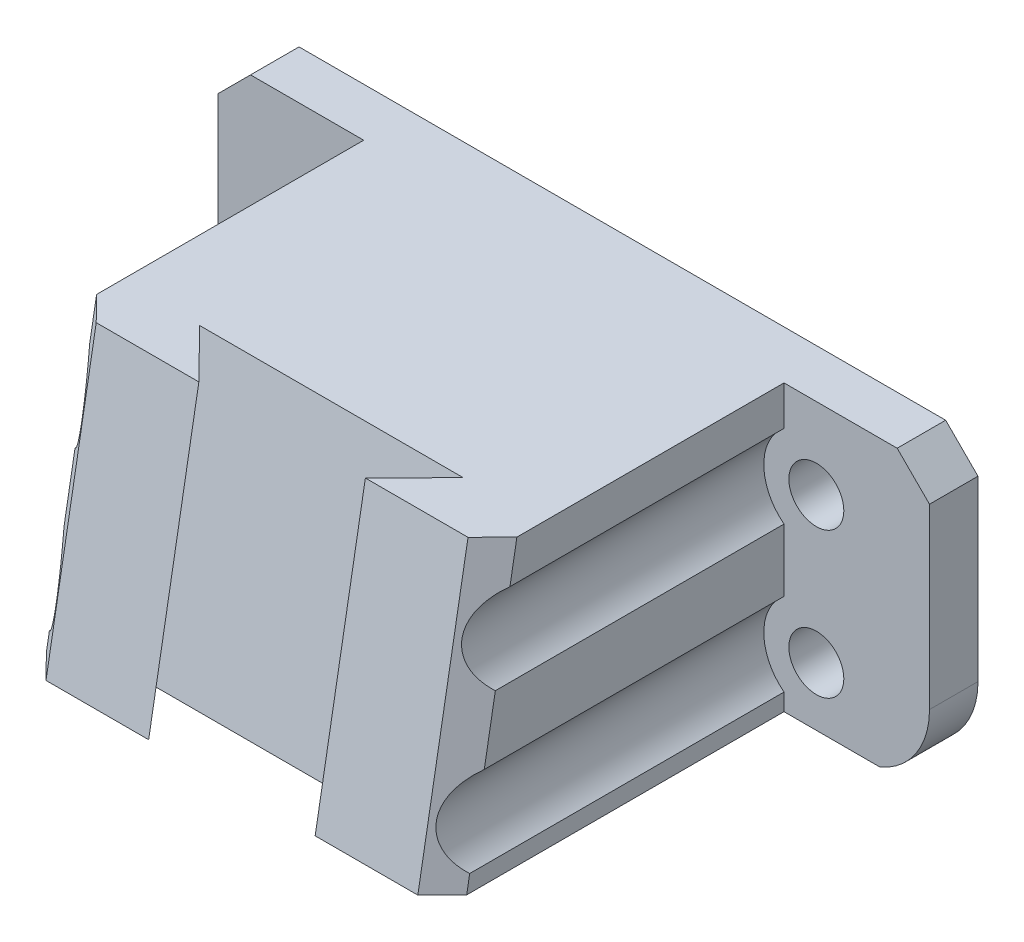
ISO-10303-21;
HEADER;
FILE_DESCRIPTION(('STEP AP214'),'2;1');
FILE_NAME('part.step','',(''),(''),'','','');
FILE_SCHEMA(('AUTOMOTIVE_DESIGN { 1 0 10303 214 1 1 1 1 }'));
ENDSEC;
DATA;
#1=APPLICATION_CONTEXT('core data for automotive mechanical design processes');
#2=APPLICATION_PROTOCOL_DEFINITION('international standard','automotive_design',2000,#1);
#3=PRODUCT_CONTEXT('',#1,'mechanical');
#4=PRODUCT('Part','Part','',(#3));
#5=PRODUCT_RELATED_PRODUCT_CATEGORY('part','',(#4));
#6=PRODUCT_DEFINITION_FORMATION('','',#4);
#7=PRODUCT_DEFINITION_CONTEXT('part definition',#1,'design');
#8=PRODUCT_DEFINITION('design','',#6,#7);
#9=PRODUCT_DEFINITION_SHAPE('','',#8);
#10=(LENGTH_UNIT() NAMED_UNIT(*) SI_UNIT(.MILLI.,.METRE.));
#11=(NAMED_UNIT(*) PLANE_ANGLE_UNIT() SI_UNIT($,.RADIAN.));
#12=(NAMED_UNIT(*) SI_UNIT($,.STERADIAN.) SOLID_ANGLE_UNIT());
#13=UNCERTAINTY_MEASURE_WITH_UNIT(LENGTH_MEASURE(1.E-05),#10,'distance_accuracy_value','');
#14=(GEOMETRIC_REPRESENTATION_CONTEXT(3) GLOBAL_UNCERTAINTY_ASSIGNED_CONTEXT((#13)) GLOBAL_UNIT_ASSIGNED_CONTEXT((#10,
#11,#12)) REPRESENTATION_CONTEXT('',''));
#15=CARTESIAN_POINT('',(0.,0.,0.));
#16=DIRECTION('',(0.,0.,1.));
#17=DIRECTION('',(1.,0.,0.));
#18=AXIS2_PLACEMENT_3D('',#15,#16,#17);
#19=CARTESIAN_POINT('',(-35.,0.,0.));
#20=DIRECTION('',(-1.,0.,0.));
#21=DIRECTION('',(0.,-1.,0.));
#22=AXIS2_PLACEMENT_3D('',#19,#20,#21);
#23=PLANE('',#22);
#24=DIRECTION('',(0.,1.,0.));
#25=VECTOR('',#24,1.);
#26=CARTESIAN_POINT('',(-35.,-5.11538461538463,3.));
#27=LINE('',#26,#25);
#28=CARTESIAN_POINT('',(-35.,1.06173769148989,3.));
#29=VERTEX_POINT('',#28);
#30=CARTESIAN_POINT('',(-35.,4.93826230851007,3.));
#31=VERTEX_POINT('',#30);
#32=EDGE_CURVE('E228',#29,#31,#27,.T.);
#33=ORIENTED_EDGE('',*,*,#32,.F.);
#34=DIRECTION('',(0.,0.,-1.));
#35=VECTOR('',#34,1.);
#36=CARTESIAN_POINT('',(-35.,1.06173769148989,24.1533474189063));
#37=LINE('',#36,#35);
#38=CARTESIAN_POINT('',(-35.,1.06173769148989,21.5400141752396));
#39=VERTEX_POINT('',#38);
#40=EDGE_CURVE('E215',#39,#29,#37,.T.);
#41=ORIENTED_EDGE('',*,*,#40,.F.);
#42=DIRECTION('',(0.,0.984807753012207,-0.173648177666934));
#43=VECTOR('',#42,1.);
#44=CARTESIAN_POINT('',(-35.,-13.4552683395418,24.099754017618));
#45=LINE('',#44,#43);
#46=CARTESIAN_POINT('',(-35.,4.93826230851006,20.8564782938784));
#47=VERTEX_POINT('',#46);
#48=EDGE_CURVE('E226',#39,#47,#45,.T.);
#49=ORIENTED_EDGE('',*,*,#48,.T.);
#50=DIRECTION('',(0.,0.,-1.));
#51=VECTOR('',#50,1.);
#52=CARTESIAN_POINT('',(-35.,4.93826230851007,24.1533474189063));
#53=LINE('',#52,#51);
#54=EDGE_CURVE('E56',#31,#47,#53,.F.);
#55=ORIENTED_EDGE('',*,*,#54,.F.);
#56=EDGE_LOOP('',(#33,#41,#49,#55));
#57=FACE_BOUND('',#56,.T.);
#58=ADVANCED_FACE('F41',(#57),#23,.T.);
#59=CARTESIAN_POINT('',(-35.,-5.11538461538465,22.6292075010777));
#60=VERTEX_POINT('',#59);
#61=CARTESIAN_POINT('',(-35.,-4.06173769148992,22.4434211202546));
#62=VERTEX_POINT('',#61);
#63=EDGE_CURVE('E233',#60,#62,#45,.T.);
#64=ORIENTED_EDGE('',*,*,#63,.T.);
#65=DIRECTION('',(0.,0.,-1.));
#66=VECTOR('',#65,1.);
#67=CARTESIAN_POINT('',(-35.,-4.06173769148991,24.1533474189063));
#68=LINE('',#67,#66);
#69=CARTESIAN_POINT('',(-35.,-4.06173769148991,3.));
#70=VERTEX_POINT('',#69);
#71=EDGE_CURVE('E64',#70,#62,#68,.F.);
#72=ORIENTED_EDGE('',*,*,#71,.F.);
#73=CARTESIAN_POINT('',(-35.,-5.11538461538463,3.));
#74=VERTEX_POINT('',#73);
#75=EDGE_CURVE('E258',#74,#70,#27,.T.);
#76=ORIENTED_EDGE('',*,*,#75,.F.);
#77=DIRECTION('',(0.,0.,-1.));
#78=VECTOR('',#77,1.);
#79=CARTESIAN_POINT('',(-35.,-5.11538461538465,21.1060675832492));
#80=LINE('',#79,#78);
#81=EDGE_CURVE('E255',#60,#74,#80,.T.);
#82=ORIENTED_EDGE('',*,*,#81,.F.);
#83=EDGE_LOOP('',(#64,#72,#76,#82));
#84=FACE_BOUND('',#83,.T.);
#85=ADVANCED_FACE('F469',(#84),#23,.T.);
#86=CARTESIAN_POINT('',(-35.,10.0617376914899,3.));
#87=VERTEX_POINT('',#86);
#88=CARTESIAN_POINT('',(-35.,12.5,3.));
#89=VERTEX_POINT('',#88);
#90=EDGE_CURVE('E257',#87,#89,#27,.T.);
#91=ORIENTED_EDGE('',*,*,#90,.F.);
#92=DIRECTION('',(0.,0.,-1.));
#93=VECTOR('',#92,1.);
#94=CARTESIAN_POINT('',(-35.,10.0617376914899,24.1533474189063));
#95=LINE('',#94,#93);
#96=CARTESIAN_POINT('',(-35.,10.0617376914899,19.9530713488634));
#97=VERTEX_POINT('',#96);
#98=EDGE_CURVE('E488',#97,#87,#95,.T.);
#99=ORIENTED_EDGE('',*,*,#98,.F.);
#100=CARTESIAN_POINT('',(-35.,12.5,19.5231399178285));
#101=VERTEX_POINT('',#100);
#102=EDGE_CURVE('E234',#97,#101,#45,.T.);
#103=ORIENTED_EDGE('',*,*,#102,.T.);
#104=DIRECTION('',(0.,0.,1.));
#105=VECTOR('',#104,1.);
#106=CARTESIAN_POINT('',(-35.,12.5,3.));
#107=LINE('',#106,#105);
#108=EDGE_CURVE('E251',#89,#101,#107,.T.);
#109=ORIENTED_EDGE('',*,*,#108,.F.);
#110=EDGE_LOOP('',(#91,#99,#103,#109));
#111=FACE_BOUND('',#110,.T.);
#112=ADVANCED_FACE('F471',(#111),#23,.T.);
#113=CARTESIAN_POINT('',(-9.00000000000001,0.,0.));
#114=DIRECTION('',(-1.,0.,0.));
#115=DIRECTION('',(0.,-1.,0.));
#116=AXIS2_PLACEMENT_3D('',#113,#114,#115);
#117=PLANE('',#116);
#118=DIRECTION('',(0.,0.,-1.));
#119=VECTOR('',#118,1.);
#120=CARTESIAN_POINT('',(-9.,10.0617376914899,24.1533474189063));
#121=LINE('',#120,#119);
#122=CARTESIAN_POINT('',(-9.,10.0617376914899,19.9530713488619));
#123=VERTEX_POINT('',#122);
#124=CARTESIAN_POINT('',(-9.,10.0617376914899,3.));
#125=VERTEX_POINT('',#124);
#126=EDGE_CURVE('E510',#123,#125,#121,.T.);
#127=ORIENTED_EDGE('',*,*,#126,.T.);
#128=DIRECTION('',(0.,1.,0.));
#129=VECTOR('',#128,1.);
#130=CARTESIAN_POINT('',(-9.00000000000001,-5.11538461538465,3.));
#131=LINE('',#130,#129);
#132=CARTESIAN_POINT('',(-9.,12.5,3.));
#133=VERTEX_POINT('',#132);
#134=EDGE_CURVE('E247',#125,#133,#131,.T.);
#135=ORIENTED_EDGE('',*,*,#134,.T.);
#136=DIRECTION('',(0.,0.,1.));
#137=VECTOR('',#136,1.);
#138=CARTESIAN_POINT('',(-9.,12.5,3.));
#139=LINE('',#138,#137);
#140=CARTESIAN_POINT('',(-9.,12.5,19.5231399178271));
#141=VERTEX_POINT('',#140);
#142=EDGE_CURVE('E241',#133,#141,#139,.T.);
#143=ORIENTED_EDGE('',*,*,#142,.T.);
#144=DIRECTION('',(0.,0.984807753012207,-0.173648177666934));
#145=VECTOR('',#144,1.);
#146=CARTESIAN_POINT('',(-9.00000000000001,-13.455268339542,24.0997540176166));
#147=LINE('',#146,#145);
#148=EDGE_CURVE('E440',#123,#141,#147,.T.);
#149=ORIENTED_EDGE('',*,*,#148,.F.);
#150=EDGE_LOOP('',(#127,#135,#143,#149));
#151=FACE_BOUND('',#150,.T.);
#152=ADVANCED_FACE('F479',(#151),#117,.F.);
#153=DIRECTION('',(0.,0.,-1.));
#154=VECTOR('',#153,1.);
#155=CARTESIAN_POINT('',(-9.,4.93826230851007,24.1533474189063));
#156=LINE('',#155,#154);
#157=CARTESIAN_POINT('',(-9.,4.93826230851007,3.));
#158=VERTEX_POINT('',#157);
#159=CARTESIAN_POINT('',(-9.00000000000001,4.93826230851007,20.8564782938769));
#160=VERTEX_POINT('',#159);
#161=EDGE_CURVE('E497',#158,#160,#156,.F.);
#162=ORIENTED_EDGE('',*,*,#161,.T.);
#163=CARTESIAN_POINT('',(-9.00000000000001,1.06173769148989,21.5400141752381));
#164=VERTEX_POINT('',#163);
#165=EDGE_CURVE('E439',#164,#160,#147,.T.);
#166=ORIENTED_EDGE('',*,*,#165,.F.);
#167=DIRECTION('',(0.,0.,-1.));
#168=VECTOR('',#167,1.);
#169=CARTESIAN_POINT('',(-9.00000000000001,1.06173769148989,24.1533474189063));
#170=LINE('',#169,#168);
#171=CARTESIAN_POINT('',(-9.00000000000001,1.06173769148989,3.));
#172=VERTEX_POINT('',#171);
#173=EDGE_CURVE('E500',#164,#172,#170,.T.);
#174=ORIENTED_EDGE('',*,*,#173,.T.);
#175=EDGE_CURVE('E252',#172,#158,#131,.T.);
#176=ORIENTED_EDGE('',*,*,#175,.T.);
#177=EDGE_LOOP('',(#162,#166,#174,#176));
#178=FACE_BOUND('',#177,.T.);
#179=ADVANCED_FACE('F483',(#178),#117,.F.);
#180=DIRECTION('',(0.,0.,-1.));
#181=VECTOR('',#180,1.);
#182=CARTESIAN_POINT('',(-9.00000000000001,-4.0617376914899,24.1533474189063));
#183=LINE('',#182,#181);
#184=CARTESIAN_POINT('',(-9.00000000000001,-4.0617376914899,3.));
#185=VERTEX_POINT('',#184);
#186=CARTESIAN_POINT('',(-9.00000000000001,-4.0617376914899,22.4434211202531));
#187=VERTEX_POINT('',#186);
#188=EDGE_CURVE('E222',#185,#187,#183,.F.);
#189=ORIENTED_EDGE('',*,*,#188,.T.);
#190=CARTESIAN_POINT('',(-9.00000000000001,-5.11538461538465,22.6292075010763));
#191=VERTEX_POINT('',#190);
#192=EDGE_CURVE('E436',#191,#187,#147,.T.);
#193=ORIENTED_EDGE('',*,*,#192,.F.);
#194=DIRECTION('',(0.,0.,-1.));
#195=VECTOR('',#194,1.);
#196=CARTESIAN_POINT('',(-9.00000000000001,-5.11538461538467,21.1060675832492));
#197=LINE('',#196,#195);
#198=CARTESIAN_POINT('',(-9.00000000000001,-5.11538461538465,3.));
#199=VERTEX_POINT('',#198);
#200=EDGE_CURVE('E244',#191,#199,#197,.T.);
#201=ORIENTED_EDGE('',*,*,#200,.T.);
#202=EDGE_CURVE('E248',#199,#185,#131,.T.);
#203=ORIENTED_EDGE('',*,*,#202,.T.);
#204=EDGE_LOOP('',(#189,#193,#201,#203));
#205=FACE_BOUND('',#204,.T.);
#206=ADVANCED_FACE('F485',(#205),#117,.F.);
#207=CARTESIAN_POINT('',(-10.5,-13.1947960730414,25.5769656471363));
#208=DIRECTION('',(0.707106781186866,0.12278780396892,0.696364240319705));
#209=DIRECTION('',(0.701673843159543,0.,-0.712498293208986));
#210=AXIS2_PLACEMENT_3D('',#207,#208,#209);
#211=PLANE('',#210);
#212=ORIENTED_EDGE('',*,*,#165,.T.);
#213=CARTESIAN_POINT('',(-7.,7.49999999999997,18.3739215975961));
#214=DIRECTION('',(0.707106781186866,0.12278780396892,0.696364240319705));
#215=DIRECTION('',(0.686096888803151,0.119139474443513,-0.71768854303518));
#216=AXIS2_PLACEMENT_3D('',#213,#214,#215);
#217=ELLIPSE('',#216,4.66709777990309,3.25);
#218=EDGE_CURVE('E505',#123,#160,#217,.T.);
#219=ORIENTED_EDGE('',*,*,#218,.F.);
#220=ORIENTED_EDGE('',*,*,#148,.T.);
#221=DIRECTION('',(-0.701673843159543,0.,0.712498293208986));
#222=VECTOR('',#221,1.);
#223=CARTESIAN_POINT('',(-9.74185143927972,12.5,20.2764356113381));
#224=LINE('',#223,#222);
#225=CARTESIAN_POINT('',(-10.5,12.5,21.0462798356571));
#226=VERTEX_POINT('',#225);
#227=EDGE_CURVE('E390',#141,#226,#224,.T.);
#228=ORIENTED_EDGE('',*,*,#227,.T.);
#229=DIRECTION('',(0.,0.984807753012207,-0.173648177666934));
#230=VECTOR('',#229,1.);
#231=CARTESIAN_POINT('',(-10.5,-13.1947960730414,25.5769656471363));
#232=LINE('',#231,#230);
#233=CARTESIAN_POINT('',(-10.5,-5.11538461538465,24.1523474189063));
#234=VERTEX_POINT('',#233);
#235=EDGE_CURVE('E431',#234,#226,#232,.T.);
#236=ORIENTED_EDGE('',*,*,#235,.F.);
#237=DIRECTION('',(-0.701673843159543,0.,0.712498293208986));
#238=VECTOR('',#237,1.);
#239=CARTESIAN_POINT('',(-11.2122256537687,-5.11538461538465,24.8755603014113));
#240=LINE('',#239,#238);
#241=EDGE_CURVE('E421',#191,#234,#240,.T.);
#242=ORIENTED_EDGE('',*,*,#241,.F.);
#243=ORIENTED_EDGE('',*,*,#192,.T.);
#244=CARTESIAN_POINT('',(-7.,-1.50000000000001,19.9608644239723));
#245=DIRECTION('',(0.707106781186866,0.12278780396892,0.696364240319705));
#246=DIRECTION('',(0.686096888803151,0.119139474443513,-0.71768854303518));
#247=AXIS2_PLACEMENT_3D('',#244,#245,#246);
#248=ELLIPSE('',#247,4.66709777990309,3.25);
#249=EDGE_CURVE('E494',#164,#187,#248,.T.);
#250=ORIENTED_EDGE('',*,*,#249,.F.);
#251=EDGE_LOOP('',(#212,#219,#220,#228,#236,#242,#243,#250));
#252=FACE_BOUND('',#251,.T.);
#253=ADVANCED_FACE('F449',(#252),#211,.T.);
#254=CARTESIAN_POINT('',(-5.00000000000001,-0.500000000000039,3.));
#255=DIRECTION('',(0.,0.,1.));
#256=DIRECTION('',(1.,0.,0.));
#257=AXIS2_PLACEMENT_3D('',#254,#255,#256);
#258=PLANE('',#257);
#259=CARTESIAN_POINT('',(-37.,-1.50000000000001,3.));
#260=DIRECTION('',(0.,0.,1.));
#261=DIRECTION('',(1.,0.,0.));
#262=AXIS2_PLACEMENT_3D('',#259,#260,#261);
#263=CIRCLE('',#262,1.7);
#264=CARTESIAN_POINT('',(-35.3,-1.50000000000001,3.));
#265=VERTEX_POINT('',#264);
#266=EDGE_CURVE('E273',#265,#265,#263,.T.);
#267=ORIENTED_EDGE('',*,*,#266,.F.);
#268=EDGE_LOOP('',(#267));
#269=FACE_BOUND('',#268,.T.);
#270=CARTESIAN_POINT('',(-37.,7.49999999999997,3.));
#271=DIRECTION('',(0.,0.,1.));
#272=DIRECTION('',(1.,0.,0.));
#273=AXIS2_PLACEMENT_3D('',#270,#271,#272);
#274=CIRCLE('',#273,1.7);
#275=CARTESIAN_POINT('',(-35.3,7.49999999999997,3.));
#276=VERTEX_POINT('',#275);
#277=EDGE_CURVE('E265',#276,#276,#274,.T.);
#278=ORIENTED_EDGE('',*,*,#277,.F.);
#279=EDGE_LOOP('',(#278));
#280=FACE_BOUND('',#279,.T.);
#281=DIRECTION('',(1.,0.,0.));
#282=VECTOR('',#281,1.);
#283=CARTESIAN_POINT('',(-40.9230769230769,-5.11538461538465,3.));
#284=LINE('',#283,#282);
#285=CARTESIAN_POINT('',(-40.9230769230769,-5.11538461538465,3.));
#286=VERTEX_POINT('',#285);
#287=EDGE_CURVE('E311',#286,#74,#284,.T.);
#288=ORIENTED_EDGE('',*,*,#287,.T.);
#289=ORIENTED_EDGE('',*,*,#75,.T.);
#290=CARTESIAN_POINT('',(-37.,-1.50000000000001,3.));
#291=DIRECTION('',(0.,0.,1.));
#292=DIRECTION('',(1.,0.,0.));
#293=AXIS2_PLACEMENT_3D('',#290,#291,#292);
#294=CIRCLE('',#293,3.25);
#295=EDGE_CURVE('E221',#70,#29,#294,.T.);
#296=ORIENTED_EDGE('',*,*,#295,.T.);
#297=ORIENTED_EDGE('',*,*,#32,.T.);
#298=CARTESIAN_POINT('',(-37.,7.49999999999997,3.));
#299=DIRECTION('',(0.,0.,1.));
#300=DIRECTION('',(1.,0.,0.));
#301=AXIS2_PLACEMENT_3D('',#298,#299,#300);
#302=CIRCLE('',#301,3.25);
#303=EDGE_CURVE('E489',#31,#87,#302,.T.);
#304=ORIENTED_EDGE('',*,*,#303,.T.);
#305=ORIENTED_EDGE('',*,*,#90,.T.);
#306=DIRECTION('',(-1.,0.,0.));
#307=VECTOR('',#306,1.);
#308=CARTESIAN_POINT('',(-2.00000000000001,12.5,3.));
#309=LINE('',#308,#307);
#310=CARTESIAN_POINT('',(-42.,12.5,3.));
#311=VERTEX_POINT('',#310);
#312=EDGE_CURVE('E300',#89,#311,#309,.T.);
#313=ORIENTED_EDGE('',*,*,#312,.T.);
#314=DIRECTION('',(-0.707106781186547,-0.707106781186547,0.));
#315=VECTOR('',#314,1.);
#316=CARTESIAN_POINT('',(-42.,12.5,3.));
#317=LINE('',#316,#315);
#318=CARTESIAN_POINT('',(-44.,10.5,3.));
#319=VERTEX_POINT('',#318);
#320=EDGE_CURVE('E304',#311,#319,#317,.T.);
#321=ORIENTED_EDGE('',*,*,#320,.T.);
#322=DIRECTION('',(0.,-1.,0.));
#323=VECTOR('',#322,1.);
#324=CARTESIAN_POINT('',(-44.,10.5,3.));
#325=LINE('',#324,#323);
#326=CARTESIAN_POINT('',(-44.,-0.500000000000034,3.));
#327=VERTEX_POINT('',#326);
#328=EDGE_CURVE('E306',#319,#327,#325,.T.);
#329=ORIENTED_EDGE('',*,*,#328,.T.);
#330=CARTESIAN_POINT('',(-39.,-0.500000000000037,3.));
#331=DIRECTION('',(0.,0.,1.));
#332=DIRECTION('',(1.,0.,0.));
#333=AXIS2_PLACEMENT_3D('',#330,#331,#332);
#334=CIRCLE('',#333,5.);
#335=EDGE_CURVE('E308',#327,#286,#334,.T.);
#336=ORIENTED_EDGE('',*,*,#335,.T.);
#337=EDGE_LOOP('',(#288,#289,#296,#297,#304,#305,#313,#321,#329,#336));
#338=FACE_BOUND('',#337,.T.);
#339=ADVANCED_FACE('F371',(#269,#280,#338),#258,.T.);
#340=CARTESIAN_POINT('',(-5.00000000000001,-0.500000000000039,3.));
#341=DIRECTION('',(0.,0.,-1.));
#342=DIRECTION('',(-1.,0.,0.));
#343=AXIS2_PLACEMENT_3D('',#340,#341,#342);
#344=CYLINDRICAL_SURFACE('',#343,5.);
#345=CARTESIAN_POINT('',(-5.00000000000001,-0.500000000000039,0.));
#346=DIRECTION('',(0.,0.,1.));
#347=DIRECTION('',(1.,0.,0.));
#348=AXIS2_PLACEMENT_3D('',#345,#346,#347);
#349=CIRCLE('',#348,5.);
#350=CARTESIAN_POINT('',(-3.07692307692308,-5.11538461538465,0.));
#351=VERTEX_POINT('',#350);
#352=CARTESIAN_POINT('',(0.,-0.500000000000039,0.));
#353=VERTEX_POINT('',#352);
#354=EDGE_CURVE('E291',#351,#353,#349,.T.);
#355=ORIENTED_EDGE('',*,*,#354,.T.);
#356=DIRECTION('',(0.,0.,-1.));
#357=VECTOR('',#356,1.);
#358=CARTESIAN_POINT('',(0.,-0.500000000000039,3.));
#359=LINE('',#358,#357);
#360=CARTESIAN_POINT('',(0.,-0.500000000000039,3.));
#361=VERTEX_POINT('',#360);
#362=EDGE_CURVE('E11',#361,#353,#359,.T.);
#363=ORIENTED_EDGE('',*,*,#362,.F.);
#364=CARTESIAN_POINT('',(-5.00000000000001,-0.500000000000039,3.));
#365=DIRECTION('',(0.,0.,1.));
#366=DIRECTION('',(1.,0.,0.));
#367=AXIS2_PLACEMENT_3D('',#364,#365,#366);
#368=CIRCLE('',#367,5.);
#369=CARTESIAN_POINT('',(-3.07692307692308,-5.11538461538465,3.));
#370=VERTEX_POINT('',#369);
#371=EDGE_CURVE('E292',#370,#361,#368,.T.);
#372=ORIENTED_EDGE('',*,*,#371,.F.);
#373=DIRECTION('',(0.,0.,-1.));
#374=VECTOR('',#373,1.);
#375=CARTESIAN_POINT('',(-3.07692307692308,-5.11538461538465,3.));
#376=LINE('',#375,#374);
#377=EDGE_CURVE('E314',#370,#351,#376,.T.);
#378=ORIENTED_EDGE('',*,*,#377,.T.);
#379=EDGE_LOOP('',(#355,#363,#372,#378));
#380=FACE_BOUND('',#379,.T.);
#381=ADVANCED_FACE('F43',(#380),#344,.T.);
#382=CARTESIAN_POINT('',(0.,-0.500000000000039,3.));
#383=DIRECTION('',(-1.,0.,0.));
#384=DIRECTION('',(0.,-1.,0.));
#385=AXIS2_PLACEMENT_3D('',#382,#383,#384);
#386=PLANE('',#385);
#387=DIRECTION('',(0.,1.,0.));
#388=VECTOR('',#387,1.);
#389=CARTESIAN_POINT('',(0.,-0.500000000000039,0.));
#390=LINE('',#389,#388);
#391=CARTESIAN_POINT('',(0.,10.4999999999999,0.));
#392=VERTEX_POINT('',#391);
#393=EDGE_CURVE('E317',#353,#392,#390,.T.);
#394=ORIENTED_EDGE('',*,*,#393,.T.);
#395=DIRECTION('',(0.,0.,-1.));
#396=VECTOR('',#395,1.);
#397=CARTESIAN_POINT('',(0.,10.4999999999999,3.));
#398=LINE('',#397,#396);
#399=CARTESIAN_POINT('',(0.,10.4999999999999,3.));
#400=VERTEX_POINT('',#399);
#401=EDGE_CURVE('E49',#400,#392,#398,.T.);
#402=ORIENTED_EDGE('',*,*,#401,.F.);
#403=DIRECTION('',(0.,1.,0.));
#404=VECTOR('',#403,1.);
#405=CARTESIAN_POINT('',(0.,-0.500000000000039,3.));
#406=LINE('',#405,#404);
#407=EDGE_CURVE('E295',#361,#400,#406,.T.);
#408=ORIENTED_EDGE('',*,*,#407,.F.);
#409=ORIENTED_EDGE('',*,*,#362,.T.);
#410=EDGE_LOOP('',(#394,#402,#408,#409));
#411=FACE_BOUND('',#410,.T.);
#412=ADVANCED_FACE('F549',(#411),#386,.F.);
#413=CARTESIAN_POINT('',(0.,10.4999999999999,3.));
#414=DIRECTION('',(-0.707106781186553,-0.707106781186542,0.));
#415=DIRECTION('',(0.707106781186542,-0.707106781186553,0.));
#416=AXIS2_PLACEMENT_3D('',#413,#414,#415);
#417=PLANE('',#416);
#418=DIRECTION('',(-0.707106781186542,0.707106781186553,0.));
#419=VECTOR('',#418,1.);
#420=CARTESIAN_POINT('',(0.,10.4999999999999,0.));
#421=LINE('',#420,#419);
#422=CARTESIAN_POINT('',(-2.00000000000001,12.5,0.));
#423=VERTEX_POINT('',#422);
#424=EDGE_CURVE('E319',#392,#423,#421,.T.);
#425=ORIENTED_EDGE('',*,*,#424,.T.);
#426=DIRECTION('',(0.,0.,-1.));
#427=VECTOR('',#426,1.);
#428=CARTESIAN_POINT('',(-2.00000000000001,12.5,3.));
#429=LINE('',#428,#427);
#430=CARTESIAN_POINT('',(-2.00000000000001,12.5,3.));
#431=VERTEX_POINT('',#430);
#432=EDGE_CURVE('E344',#431,#423,#429,.T.);
#433=ORIENTED_EDGE('',*,*,#432,.F.);
#434=DIRECTION('',(-0.707106781186542,0.707106781186553,0.));
#435=VECTOR('',#434,1.);
#436=CARTESIAN_POINT('',(0.,10.4999999999999,3.));
#437=LINE('',#436,#435);
#438=EDGE_CURVE('E298',#400,#431,#437,.T.);
#439=ORIENTED_EDGE('',*,*,#438,.F.);
#440=ORIENTED_EDGE('',*,*,#401,.T.);
#441=EDGE_LOOP('',(#425,#433,#439,#440));
#442=FACE_BOUND('',#441,.T.);
#443=ADVANCED_FACE('F351',(#442),#417,.F.);
#444=CARTESIAN_POINT('',(-2.00000000000001,12.5,3.));
#445=DIRECTION('',(0.,-1.,0.));
#446=DIRECTION('',(1.,0.,0.));
#447=AXIS2_PLACEMENT_3D('',#444,#445,#446);
#448=PLANE('',#447);
#449=DIRECTION('',(-1.,0.,0.));
#450=VECTOR('',#449,1.);
#451=CARTESIAN_POINT('',(-2.00000000000001,12.5,0.));
#452=LINE('',#451,#450);
#453=CARTESIAN_POINT('',(-42.,12.5,0.));
#454=VERTEX_POINT('',#453);
#455=EDGE_CURVE('E321',#423,#454,#452,.T.);
#456=ORIENTED_EDGE('',*,*,#455,.T.);
#457=DIRECTION('',(0.,0.,-1.));
#458=VECTOR('',#457,1.);
#459=CARTESIAN_POINT('',(-42.,12.5,3.));
#460=LINE('',#459,#458);
#461=EDGE_CURVE('E341',#311,#454,#460,.T.);
#462=ORIENTED_EDGE('',*,*,#461,.F.);
#463=ORIENTED_EDGE('',*,*,#312,.F.);
#464=ORIENTED_EDGE('',*,*,#108,.T.);
#465=DIRECTION('',(-0.701673843159882,0.,-0.712498293208652));
#466=VECTOR('',#465,1.);
#467=CARTESIAN_POINT('',(-35.7351871072445,12.5,18.7766113644172));
#468=LINE('',#467,#466);
#469=CARTESIAN_POINT('',(-33.5,12.5,21.0462798356571));
#470=VERTEX_POINT('',#469);
#471=EDGE_CURVE('E237',#470,#101,#468,.T.);
#472=ORIENTED_EDGE('',*,*,#471,.F.);
#473=DIRECTION('',(-1.,0.,0.));
#474=VECTOR('',#473,1.);
#475=CARTESIAN_POINT('',(-33.5,12.5,21.0462798356571));
#476=LINE('',#475,#474);
#477=CARTESIAN_POINT('',(-27.1500000000015,12.5,21.0462798356571));
#478=VERTEX_POINT('',#477);
#479=EDGE_CURVE('E382',#478,#470,#476,.T.);
#480=ORIENTED_EDGE('',*,*,#479,.F.);
#481=DIRECTION('',(0.701673843159881,0.,0.712498293208652));
#482=VECTOR('',#481,1.);
#483=CARTESIAN_POINT('',(-27.9081485607217,12.5,20.2764356113389));
#484=LINE('',#483,#482);
#485=CARTESIAN_POINT('',(-30.1500000000014,12.5,18.));
#486=VERTEX_POINT('',#485);
#487=EDGE_CURVE('E384',#486,#478,#484,.T.);
#488=ORIENTED_EDGE('',*,*,#487,.F.);
#489=DIRECTION('',(1.,0.,0.));
#490=VECTOR('',#489,1.);
#491=CARTESIAN_POINT('',(-35.,12.5,18.));
#492=LINE('',#491,#490);
#493=CARTESIAN_POINT('',(-13.8500000000014,12.5,18.));
#494=VERTEX_POINT('',#493);
#495=EDGE_CURVE('E261',#486,#494,#492,.T.);
#496=ORIENTED_EDGE('',*,*,#495,.T.);
#497=DIRECTION('',(0.701673843159543,0.,-0.712498293208985));
#498=VECTOR('',#497,1.);
#499=CARTESIAN_POINT('',(-13.1377743462328,12.5,17.2767871174949));
#500=LINE('',#499,#498);
#501=CARTESIAN_POINT('',(-16.8499999999986,12.5,21.0462798356571));
#502=VERTEX_POINT('',#501);
#503=EDGE_CURVE('E426',#502,#494,#500,.T.);
#504=ORIENTED_EDGE('',*,*,#503,.F.);
#505=DIRECTION('',(-1.,0.,0.));
#506=VECTOR('',#505,1.);
#507=CARTESIAN_POINT('',(-16.8499999999985,12.5,21.0462798356571));
#508=LINE('',#507,#506);
#509=EDGE_CURVE('E429',#226,#502,#508,.T.);
#510=ORIENTED_EDGE('',*,*,#509,.F.);
#511=ORIENTED_EDGE('',*,*,#227,.F.);
#512=ORIENTED_EDGE('',*,*,#142,.F.);
#513=EDGE_CURVE('E301',#431,#133,#309,.T.);
#514=ORIENTED_EDGE('',*,*,#513,.F.);
#515=ORIENTED_EDGE('',*,*,#432,.T.);
#516=EDGE_LOOP('',(#456,#462,#463,#464,#472,#480,#488,#496,#504,#510,#511,#512,#514,#515));
#517=FACE_BOUND('',#516,.T.);
#518=ADVANCED_FACE('F362',(#517),#448,.F.);
#519=CARTESIAN_POINT('',(-42.,12.5,3.));
#520=DIRECTION('',(0.707106781186548,-0.707106781186548,0.));
#521=DIRECTION('',(0.707106781186548,0.707106781186548,0.));
#522=AXIS2_PLACEMENT_3D('',#519,#520,#521);
#523=PLANE('',#522);
#524=DIRECTION('',(-0.707106781186547,-0.707106781186547,0.));
#525=VECTOR('',#524,1.);
#526=CARTESIAN_POINT('',(-42.,12.5,0.));
#527=LINE('',#526,#525);
#528=CARTESIAN_POINT('',(-44.,10.5,0.));
#529=VERTEX_POINT('',#528);
#530=EDGE_CURVE('E323',#454,#529,#527,.T.);
#531=ORIENTED_EDGE('',*,*,#530,.T.);
#532=DIRECTION('',(0.,0.,-1.));
#533=VECTOR('',#532,1.);
#534=CARTESIAN_POINT('',(-44.,10.5,3.));
#535=LINE('',#534,#533);
#536=EDGE_CURVE('E338',#319,#529,#535,.T.);
#537=ORIENTED_EDGE('',*,*,#536,.F.);
#538=ORIENTED_EDGE('',*,*,#320,.F.);
#539=ORIENTED_EDGE('',*,*,#461,.T.);
#540=EDGE_LOOP('',(#531,#537,#538,#539));
#541=FACE_BOUND('',#540,.T.);
#542=ADVANCED_FACE('F367',(#541),#523,.F.);
#543=CARTESIAN_POINT('',(-44.,10.5,3.));
#544=DIRECTION('',(1.,0.,0.));
#545=DIRECTION('',(0.,1.,0.));
#546=AXIS2_PLACEMENT_3D('',#543,#544,#545);
#547=PLANE('',#546);
#548=DIRECTION('',(0.,-1.,0.));
#549=VECTOR('',#548,1.);
#550=CARTESIAN_POINT('',(-44.,10.5,0.));
#551=LINE('',#550,#549);
#552=CARTESIAN_POINT('',(-44.,-0.500000000000034,0.));
#553=VERTEX_POINT('',#552);
#554=EDGE_CURVE('E325',#529,#553,#551,.T.);
#555=ORIENTED_EDGE('',*,*,#554,.T.);
#556=DIRECTION('',(0.,0.,-1.));
#557=VECTOR('',#556,1.);
#558=CARTESIAN_POINT('',(-44.,-0.500000000000034,3.));
#559=LINE('',#558,#557);
#560=EDGE_CURVE('E335',#327,#553,#559,.T.);
#561=ORIENTED_EDGE('',*,*,#560,.F.);
#562=ORIENTED_EDGE('',*,*,#328,.F.);
#563=ORIENTED_EDGE('',*,*,#536,.T.);
#564=EDGE_LOOP('',(#555,#561,#562,#563));
#565=FACE_BOUND('',#564,.T.);
#566=ADVANCED_FACE('F559',(#565),#547,.F.);
#567=CARTESIAN_POINT('',(-39.,-0.500000000000037,3.));
#568=DIRECTION('',(0.,0.,-1.));
#569=DIRECTION('',(-1.,0.,0.));
#570=AXIS2_PLACEMENT_3D('',#567,#568,#569);
#571=CYLINDRICAL_SURFACE('',#570,5.);
#572=CARTESIAN_POINT('',(-39.,-0.500000000000037,0.));
#573=DIRECTION('',(0.,0.,1.));
#574=DIRECTION('',(1.,0.,0.));
#575=AXIS2_PLACEMENT_3D('',#572,#573,#574);
#576=CIRCLE('',#575,5.);
#577=CARTESIAN_POINT('',(-40.9230769230769,-5.11538461538465,0.));
#578=VERTEX_POINT('',#577);
#579=EDGE_CURVE('E327',#553,#578,#576,.T.);
#580=ORIENTED_EDGE('',*,*,#579,.T.);
#581=DIRECTION('',(0.,0.,-1.));
#582=VECTOR('',#581,1.);
#583=CARTESIAN_POINT('',(-40.9230769230769,-5.11538461538465,3.));
#584=LINE('',#583,#582);
#585=EDGE_CURVE('E332',#286,#578,#584,.T.);
#586=ORIENTED_EDGE('',*,*,#585,.F.);
#587=ORIENTED_EDGE('',*,*,#335,.F.);
#588=ORIENTED_EDGE('',*,*,#560,.T.);
#589=EDGE_LOOP('',(#580,#586,#587,#588));
#590=FACE_BOUND('',#589,.T.);
#591=ADVANCED_FACE('F557',(#590),#571,.T.);
#592=CARTESIAN_POINT('',(-40.9230769230769,-5.11538461538465,3.));
#593=DIRECTION('',(0.,1.,0.));
#594=DIRECTION('',(-1.,0.,0.));
#595=AXIS2_PLACEMENT_3D('',#592,#593,#594);
#596=PLANE('',#595);
#597=DIRECTION('',(1.,0.,0.));
#598=VECTOR('',#597,1.);
#599=CARTESIAN_POINT('',(-40.9230769230769,-5.11538461538465,0.));
#600=LINE('',#599,#598);
#601=EDGE_CURVE('E296',#578,#351,#600,.T.);
#602=ORIENTED_EDGE('',*,*,#601,.T.);
#603=ORIENTED_EDGE('',*,*,#377,.F.);
#604=EDGE_CURVE('E310',#199,#370,#284,.T.);
#605=ORIENTED_EDGE('',*,*,#604,.F.);
#606=ORIENTED_EDGE('',*,*,#200,.F.);
#607=ORIENTED_EDGE('',*,*,#241,.T.);
#608=DIRECTION('',(-1.,0.,0.));
#609=VECTOR('',#608,1.);
#610=CARTESIAN_POINT('',(-16.8499999999986,-5.11538461538465,24.1523474189063));
#611=LINE('',#610,#609);
#612=CARTESIAN_POINT('',(-16.8499999999986,-5.11538461538465,24.1523474189063));
#613=VERTEX_POINT('',#612);
#614=EDGE_CURVE('E418',#234,#613,#611,.T.);
#615=ORIENTED_EDGE('',*,*,#614,.T.);
#616=DIRECTION('',(0.701673843159543,0.,-0.712498293208985));
#617=VECTOR('',#616,1.);
#618=CARTESIAN_POINT('',(-14.6081485607217,-5.11538461538465,21.8759118075681));
#619=LINE('',#618,#617);
#620=CARTESIAN_POINT('',(-13.8500000000014,-5.11538461538465,21.1060675832492));
#621=VERTEX_POINT('',#620);
#622=EDGE_CURVE('E415',#613,#621,#619,.T.);
#623=ORIENTED_EDGE('',*,*,#622,.T.);
#624=DIRECTION('',(1.,0.,0.));
#625=VECTOR('',#624,1.);
#626=CARTESIAN_POINT('',(-35.,-5.11538461538465,21.1060675832492));
#627=LINE('',#626,#625);
#628=CARTESIAN_POINT('',(-30.1500000000014,-5.11538461538465,21.1060675832492));
#629=VERTEX_POINT('',#628);
#630=EDGE_CURVE('E262',#629,#621,#627,.T.);
#631=ORIENTED_EDGE('',*,*,#630,.F.);
#632=DIRECTION('',(0.701673843159881,0.,0.712498293208652));
#633=VECTOR('',#632,1.);
#634=CARTESIAN_POINT('',(-26.4377743462328,-5.11538461538465,24.8755603014106));
#635=LINE('',#634,#633);
#636=CARTESIAN_POINT('',(-27.1500000000015,-5.11538461538465,24.1523474189062));
#637=VERTEX_POINT('',#636);
#638=EDGE_CURVE('E245',#629,#637,#635,.T.);
#639=ORIENTED_EDGE('',*,*,#638,.T.);
#640=DIRECTION('',(-1.,0.,0.));
#641=VECTOR('',#640,1.);
#642=CARTESIAN_POINT('',(-33.5,-5.11538461538465,24.1523474189062));
#643=LINE('',#642,#641);
#644=CARTESIAN_POINT('',(-33.5,-5.11538461538465,24.1523474189063));
#645=VERTEX_POINT('',#644);
#646=EDGE_CURVE('E394',#637,#645,#643,.T.);
#647=ORIENTED_EDGE('',*,*,#646,.T.);
#648=DIRECTION('',(-0.701673843159882,0.,-0.712498293208652));
#649=VECTOR('',#648,1.);
#650=CARTESIAN_POINT('',(-34.2648128927555,-5.11538461538465,23.375736054489));
#651=LINE('',#650,#649);
#652=EDGE_CURVE('E391',#645,#60,#651,.T.);
#653=ORIENTED_EDGE('',*,*,#652,.T.);
#654=ORIENTED_EDGE('',*,*,#81,.T.);
#655=ORIENTED_EDGE('',*,*,#287,.F.);
#656=ORIENTED_EDGE('',*,*,#585,.T.);
#657=EDGE_LOOP('',(#602,#603,#605,#606,#607,#615,#623,#631,#639,#647,#653,#654,#655,#656));
#658=FACE_BOUND('',#657,.T.);
#659=ADVANCED_FACE('F413',(#658),#596,.F.);
#660=ORIENTED_EDGE('',*,*,#202,.F.);
#661=ORIENTED_EDGE('',*,*,#604,.T.);
#662=ORIENTED_EDGE('',*,*,#371,.T.);
#663=ORIENTED_EDGE('',*,*,#407,.T.);
#664=ORIENTED_EDGE('',*,*,#438,.T.);
#665=ORIENTED_EDGE('',*,*,#513,.T.);
#666=ORIENTED_EDGE('',*,*,#134,.F.);
#667=CARTESIAN_POINT('',(-7.,7.49999999999997,3.));
#668=DIRECTION('',(0.,0.,1.));
#669=DIRECTION('',(1.,0.,0.));
#670=AXIS2_PLACEMENT_3D('',#667,#668,#669);
#671=CIRCLE('',#670,3.25);
#672=EDGE_CURVE('E507',#125,#158,#671,.T.);
#673=ORIENTED_EDGE('',*,*,#672,.T.);
#674=ORIENTED_EDGE('',*,*,#175,.F.);
#675=CARTESIAN_POINT('',(-7.,-1.50000000000001,3.));
#676=DIRECTION('',(0.,0.,1.));
#677=DIRECTION('',(1.,0.,0.));
#678=AXIS2_PLACEMENT_3D('',#675,#676,#677);
#679=CIRCLE('',#678,3.25);
#680=EDGE_CURVE('E496',#172,#185,#679,.T.);
#681=ORIENTED_EDGE('',*,*,#680,.T.);
#682=EDGE_LOOP('',(#660,#661,#662,#663,#664,#665,#666,#673,#674,#681));
#683=FACE_BOUND('',#682,.T.);
#684=CARTESIAN_POINT('',(-7.,7.49999999999997,3.));
#685=DIRECTION('',(0.,0.,1.));
#686=DIRECTION('',(1.,0.,0.));
#687=AXIS2_PLACEMENT_3D('',#684,#685,#686);
#688=CIRCLE('',#687,1.7);
#689=CARTESIAN_POINT('',(-5.3,7.49999999999997,3.));
#690=VERTEX_POINT('',#689);
#691=EDGE_CURVE('E279',#690,#690,#688,.T.);
#692=ORIENTED_EDGE('',*,*,#691,.F.);
#693=EDGE_LOOP('',(#692));
#694=FACE_BOUND('',#693,.T.);
#695=CARTESIAN_POINT('',(-7.,-1.50000000000001,3.));
#696=DIRECTION('',(0.,0.,1.));
#697=DIRECTION('',(1.,0.,0.));
#698=AXIS2_PLACEMENT_3D('',#695,#696,#697);
#699=CIRCLE('',#698,1.7);
#700=CARTESIAN_POINT('',(-5.3,-1.50000000000001,3.));
#701=VERTEX_POINT('',#700);
#702=EDGE_CURVE('E285',#701,#701,#699,.T.);
#703=ORIENTED_EDGE('',*,*,#702,.F.);
#704=EDGE_LOOP('',(#703));
#705=FACE_BOUND('',#704,.T.);
#706=ADVANCED_FACE('F541',(#683,#694,#705),#258,.T.);
#707=CARTESIAN_POINT('',(-5.00000000000001,-0.500000000000039,0.));
#708=DIRECTION('',(0.,0.,1.));
#709=DIRECTION('',(1.,0.,0.));
#710=AXIS2_PLACEMENT_3D('',#707,#708,#709);
#711=PLANE('',#710);
#712=CARTESIAN_POINT('',(-37.,7.49999999999997,0.));
#713=DIRECTION('',(0.,0.,1.));
#714=DIRECTION('',(1.,0.,0.));
#715=AXIS2_PLACEMENT_3D('',#712,#713,#714);
#716=CIRCLE('',#715,1.7);
#717=CARTESIAN_POINT('',(-35.3,7.49999999999997,0.));
#718=VERTEX_POINT('',#717);
#719=EDGE_CURVE('E270',#718,#718,#716,.T.);
#720=ORIENTED_EDGE('',*,*,#719,.T.);
#721=EDGE_LOOP('',(#720));
#722=FACE_BOUND('',#721,.T.);
#723=CARTESIAN_POINT('',(-37.,-1.50000000000001,0.));
#724=DIRECTION('',(0.,0.,1.));
#725=DIRECTION('',(1.,0.,0.));
#726=AXIS2_PLACEMENT_3D('',#723,#724,#725);
#727=CIRCLE('',#726,1.7);
#728=CARTESIAN_POINT('',(-35.3,-1.50000000000001,0.));
#729=VERTEX_POINT('',#728);
#730=EDGE_CURVE('E276',#729,#729,#727,.T.);
#731=ORIENTED_EDGE('',*,*,#730,.T.);
#732=EDGE_LOOP('',(#731));
#733=FACE_BOUND('',#732,.T.);
#734=CARTESIAN_POINT('',(-7.,7.49999999999997,0.));
#735=DIRECTION('',(0.,0.,1.));
#736=DIRECTION('',(1.,0.,0.));
#737=AXIS2_PLACEMENT_3D('',#734,#735,#736);
#738=CIRCLE('',#737,1.7);
#739=CARTESIAN_POINT('',(-5.3,7.49999999999997,0.));
#740=VERTEX_POINT('',#739);
#741=EDGE_CURVE('E282',#740,#740,#738,.T.);
#742=ORIENTED_EDGE('',*,*,#741,.T.);
#743=EDGE_LOOP('',(#742));
#744=FACE_BOUND('',#743,.T.);
#745=CARTESIAN_POINT('',(-7.,-1.50000000000001,0.));
#746=DIRECTION('',(0.,0.,1.));
#747=DIRECTION('',(1.,0.,0.));
#748=AXIS2_PLACEMENT_3D('',#745,#746,#747);
#749=CIRCLE('',#748,1.7);
#750=CARTESIAN_POINT('',(-5.3,-1.50000000000001,0.));
#751=VERTEX_POINT('',#750);
#752=EDGE_CURVE('E288',#751,#751,#749,.T.);
#753=ORIENTED_EDGE('',*,*,#752,.T.);
#754=EDGE_LOOP('',(#753));
#755=FACE_BOUND('',#754,.T.);
#756=ORIENTED_EDGE('',*,*,#354,.F.);
#757=ORIENTED_EDGE('',*,*,#601,.F.);
#758=ORIENTED_EDGE('',*,*,#579,.F.);
#759=ORIENTED_EDGE('',*,*,#554,.F.);
#760=ORIENTED_EDGE('',*,*,#530,.F.);
#761=ORIENTED_EDGE('',*,*,#455,.F.);
#762=ORIENTED_EDGE('',*,*,#424,.F.);
#763=ORIENTED_EDGE('',*,*,#393,.F.);
#764=EDGE_LOOP('',(#756,#757,#758,#759,#760,#761,#762,#763));
#765=FACE_BOUND('',#764,.T.);
#766=ADVANCED_FACE('F357',(#722,#733,#744,#755,#765),#711,.F.);
#767=CARTESIAN_POINT('',(-7.,-1.50000000000001,3.));
#768=DIRECTION('',(0.,0.,1.));
#769=DIRECTION('',(1.,0.,0.));
#770=AXIS2_PLACEMENT_3D('',#767,#768,#769);
#771=CYLINDRICAL_SURFACE('',#770,1.7);
#772=ORIENTED_EDGE('',*,*,#752,.F.);
#773=EDGE_LOOP('',(#772));
#774=FACE_BOUND('',#773,.T.);
#775=ORIENTED_EDGE('',*,*,#702,.T.);
#776=EDGE_LOOP('',(#775));
#777=FACE_BOUND('',#776,.T.);
#778=ADVANCED_FACE('F593',(#774,#777),#771,.F.);
#779=CARTESIAN_POINT('',(-7.,7.49999999999997,3.));
#780=DIRECTION('',(0.,0.,1.));
#781=DIRECTION('',(1.,0.,0.));
#782=AXIS2_PLACEMENT_3D('',#779,#780,#781);
#783=CYLINDRICAL_SURFACE('',#782,1.7);
#784=ORIENTED_EDGE('',*,*,#741,.F.);
#785=EDGE_LOOP('',(#784));
#786=FACE_BOUND('',#785,.T.);
#787=ORIENTED_EDGE('',*,*,#691,.T.);
#788=EDGE_LOOP('',(#787));
#789=FACE_BOUND('',#788,.T.);
#790=ADVANCED_FACE('F750',(#786,#789),#783,.F.);
#791=CARTESIAN_POINT('',(-37.,-1.50000000000001,3.));
#792=DIRECTION('',(0.,0.,1.));
#793=DIRECTION('',(1.,0.,0.));
#794=AXIS2_PLACEMENT_3D('',#791,#792,#793);
#795=CYLINDRICAL_SURFACE('',#794,1.7);
#796=ORIENTED_EDGE('',*,*,#730,.F.);
#797=EDGE_LOOP('',(#796));
#798=FACE_BOUND('',#797,.T.);
#799=ORIENTED_EDGE('',*,*,#266,.T.);
#800=EDGE_LOOP('',(#799));
#801=FACE_BOUND('',#800,.T.);
#802=ADVANCED_FACE('F759',(#798,#801),#795,.F.);
#803=CARTESIAN_POINT('',(-37.,7.49999999999997,3.));
#804=DIRECTION('',(0.,0.,1.));
#805=DIRECTION('',(1.,0.,0.));
#806=AXIS2_PLACEMENT_3D('',#803,#804,#805);
#807=CYLINDRICAL_SURFACE('',#806,1.7);
#808=ORIENTED_EDGE('',*,*,#719,.F.);
#809=EDGE_LOOP('',(#808));
#810=FACE_BOUND('',#809,.T.);
#811=ORIENTED_EDGE('',*,*,#277,.T.);
#812=EDGE_LOOP('',(#811));
#813=FACE_BOUND('',#812,.T.);
#814=ADVANCED_FACE('F609',(#810,#813),#807,.F.);
#815=CARTESIAN_POINT('',(-35.,12.5,18.));
#816=DIRECTION('',(0.,0.173648177666934,0.984807753012207));
#817=DIRECTION('',(0.,-0.984807753012207,0.173648177666934));
#818=AXIS2_PLACEMENT_3D('',#815,#816,#817);
#819=PLANE('',#818);
#820=DIRECTION('',(0.,0.984807753012207,-0.173648177666934));
#821=VECTOR('',#820,1.);
#822=CARTESIAN_POINT('',(-13.8500000000014,-13.7157406060421,22.6225423880998));
#823=LINE('',#822,#821);
#824=EDGE_CURVE('E423',#621,#494,#823,.T.);
#825=ORIENTED_EDGE('',*,*,#824,.T.);
#826=ORIENTED_EDGE('',*,*,#495,.F.);
#827=DIRECTION('',(0.,0.984807753012207,-0.173648177666934));
#828=VECTOR('',#827,1.);
#829=CARTESIAN_POINT('',(-30.1500000000014,-13.7157406060421,22.6225423880998));
#830=LINE('',#829,#828);
#831=EDGE_CURVE('E395',#629,#486,#830,.T.);
#832=ORIENTED_EDGE('',*,*,#831,.F.);
#833=ORIENTED_EDGE('',*,*,#630,.T.);
#834=EDGE_LOOP('',(#825,#826,#832,#833));
#835=FACE_BOUND('',#834,.T.);
#836=ADVANCED_FACE('F411',(#835),#819,.T.);
#837=CARTESIAN_POINT('',(-27.1500000000015,-13.1947960730414,25.5769656471363));
#838=DIRECTION('',(0.707106781186529,-0.122787803968979,-0.696364240320036));
#839=DIRECTION('',(-0.701673843159881,0.,-0.712498293208652));
#840=AXIS2_PLACEMENT_3D('',#837,#838,#839);
#841=PLANE('',#840);
#842=ORIENTED_EDGE('',*,*,#638,.F.);
#843=ORIENTED_EDGE('',*,*,#831,.T.);
#844=ORIENTED_EDGE('',*,*,#487,.T.);
#845=DIRECTION('',(0.,0.984807753012207,-0.173648177666934));
#846=VECTOR('',#845,1.);
#847=CARTESIAN_POINT('',(-27.1500000000015,-13.1947960730414,25.5769656471363));
#848=LINE('',#847,#846);
#849=EDGE_CURVE('E399',#637,#478,#848,.T.);
#850=ORIENTED_EDGE('',*,*,#849,.F.);
#851=EDGE_LOOP('',(#842,#843,#844,#850));
#852=FACE_BOUND('',#851,.T.);
#853=ADVANCED_FACE('F407',(#852),#841,.T.);
#854=CARTESIAN_POINT('',(-33.5,-13.1947960730414,25.5769656471363));
#855=DIRECTION('',(0.,0.173648177666934,0.984807753012207));
#856=DIRECTION('',(0.,-0.984807753012207,0.173648177666934));
#857=AXIS2_PLACEMENT_3D('',#854,#855,#856);
#858=PLANE('',#857);
#859=ORIENTED_EDGE('',*,*,#646,.F.);
#860=ORIENTED_EDGE('',*,*,#849,.T.);
#861=ORIENTED_EDGE('',*,*,#479,.T.);
#862=DIRECTION('',(0.,0.984807753012207,-0.173648177666934));
#863=VECTOR('',#862,1.);
#864=CARTESIAN_POINT('',(-33.5,-13.1947960730414,25.5769656471363));
#865=LINE('',#864,#863);
#866=EDGE_CURVE('E236',#645,#470,#865,.T.);
#867=ORIENTED_EDGE('',*,*,#866,.F.);
#868=EDGE_LOOP('',(#859,#860,#861,#867));
#869=FACE_BOUND('',#868,.T.);
#870=ADVANCED_FACE('F403',(#869),#858,.T.);
#871=CARTESIAN_POINT('',(-35.,-13.4552683395418,24.099754017618));
#872=DIRECTION('',(-0.707106781186529,0.122787803968979,0.696364240320036));
#873=DIRECTION('',(0.701673843159882,0.,0.712498293208652));
#874=AXIS2_PLACEMENT_3D('',#871,#872,#873);
#875=PLANE('',#874);
#876=ORIENTED_EDGE('',*,*,#48,.F.);
#877=CARTESIAN_POINT('',(-37.,-1.50000000000001,19.9608644239757));
#878=DIRECTION('',(-0.707106781186529,0.122787803968979,0.696364240320036));
#879=DIRECTION('',(-0.686096888803458,0.11913947444368,-0.717688543034859));
#880=AXIS2_PLACEMENT_3D('',#877,#878,#879);
#881=ELLIPSE('',#880,4.66709777990087,3.25);
#882=EDGE_CURVE('E212',#62,#39,#881,.T.);
#883=ORIENTED_EDGE('',*,*,#882,.F.);
#884=ORIENTED_EDGE('',*,*,#63,.F.);
#885=ORIENTED_EDGE('',*,*,#652,.F.);
#886=ORIENTED_EDGE('',*,*,#866,.T.);
#887=ORIENTED_EDGE('',*,*,#471,.T.);
#888=ORIENTED_EDGE('',*,*,#102,.F.);
#889=CARTESIAN_POINT('',(-37.,7.49999999999997,18.3739215975995));
#890=DIRECTION('',(-0.707106781186529,0.122787803968979,0.696364240320036));
#891=DIRECTION('',(-0.686096888803458,0.11913947444368,-0.717688543034859));
#892=AXIS2_PLACEMENT_3D('',#889,#890,#891);
#893=ELLIPSE('',#892,4.66709777990087,3.25);
#894=EDGE_CURVE('E232',#47,#97,#893,.T.);
#895=ORIENTED_EDGE('',*,*,#894,.F.);
#896=EDGE_LOOP('',(#876,#883,#884,#885,#886,#887,#888,#895));
#897=FACE_BOUND('',#896,.T.);
#898=ADVANCED_FACE('F230',(#897),#875,.T.);
#899=CARTESIAN_POINT('',(-16.8499999999986,-13.1947960730414,25.5769656471363));
#900=DIRECTION('',(0.,0.173648177666934,0.984807753012207));
#901=DIRECTION('',(0.,-0.984807753012207,0.173648177666934));
#902=AXIS2_PLACEMENT_3D('',#899,#900,#901);
#903=PLANE('',#902);
#904=ORIENTED_EDGE('',*,*,#614,.F.);
#905=ORIENTED_EDGE('',*,*,#235,.T.);
#906=ORIENTED_EDGE('',*,*,#509,.T.);
#907=DIRECTION('',(0.,0.984807753012207,-0.173648177666934));
#908=VECTOR('',#907,1.);
#909=CARTESIAN_POINT('',(-16.8499999999986,-13.1947960730414,25.5769656471363));
#910=LINE('',#909,#908);
#911=EDGE_CURVE('E427',#613,#502,#910,.T.);
#912=ORIENTED_EDGE('',*,*,#911,.F.);
#913=EDGE_LOOP('',(#904,#905,#906,#912));
#914=FACE_BOUND('',#913,.T.);
#915=ADVANCED_FACE('F456',(#914),#903,.T.);
#916=CARTESIAN_POINT('',(-13.8500000000014,-13.7157406060421,22.6225423880998));
#917=DIRECTION('',(-0.707106781186865,-0.12278780396892,-0.696364240319706));
#918=DIRECTION('',(-0.701673843159543,0.,0.712498293208985));
#919=AXIS2_PLACEMENT_3D('',#916,#917,#918);
#920=PLANE('',#919);
#921=ORIENTED_EDGE('',*,*,#622,.F.);
#922=ORIENTED_EDGE('',*,*,#911,.T.);
#923=ORIENTED_EDGE('',*,*,#503,.T.);
#924=ORIENTED_EDGE('',*,*,#824,.F.);
#925=EDGE_LOOP('',(#921,#922,#923,#924));
#926=FACE_BOUND('',#925,.T.);
#927=ADVANCED_FACE('F424',(#926),#920,.T.);
#928=CARTESIAN_POINT('',(-7.,-1.50000000000001,24.1533474189063));
#929=DIRECTION('',(0.,0.,-1.));
#930=DIRECTION('',(-1.,0.,0.));
#931=AXIS2_PLACEMENT_3D('',#928,#929,#930);
#932=CYLINDRICAL_SURFACE('',#931,3.25);
#933=ORIENTED_EDGE('',*,*,#249,.T.);
#934=ORIENTED_EDGE('',*,*,#188,.F.);
#935=ORIENTED_EDGE('',*,*,#680,.F.);
#936=ORIENTED_EDGE('',*,*,#173,.F.);
#937=EDGE_LOOP('',(#933,#934,#935,#936));
#938=FACE_BOUND('',#937,.T.);
#939=ADVANCED_FACE('F463',(#938),#932,.F.);
#940=CARTESIAN_POINT('',(-7.,7.49999999999997,24.1533474189063));
#941=DIRECTION('',(0.,0.,-1.));
#942=DIRECTION('',(-1.,0.,0.));
#943=AXIS2_PLACEMENT_3D('',#940,#941,#942);
#944=CYLINDRICAL_SURFACE('',#943,3.25);
#945=ORIENTED_EDGE('',*,*,#218,.T.);
#946=ORIENTED_EDGE('',*,*,#161,.F.);
#947=ORIENTED_EDGE('',*,*,#672,.F.);
#948=ORIENTED_EDGE('',*,*,#126,.F.);
#949=EDGE_LOOP('',(#945,#946,#947,#948));
#950=FACE_BOUND('',#949,.T.);
#951=ADVANCED_FACE('F519',(#950),#944,.F.);
#952=CARTESIAN_POINT('',(-37.,7.49999999999997,24.1533474189063));
#953=DIRECTION('',(0.,0.,-1.));
#954=DIRECTION('',(-1.,0.,0.));
#955=AXIS2_PLACEMENT_3D('',#952,#953,#954);
#956=CYLINDRICAL_SURFACE('',#955,3.25);
#957=ORIENTED_EDGE('',*,*,#98,.T.);
#958=ORIENTED_EDGE('',*,*,#303,.F.);
#959=ORIENTED_EDGE('',*,*,#54,.T.);
#960=ORIENTED_EDGE('',*,*,#894,.T.);
#961=EDGE_LOOP('',(#957,#958,#959,#960));
#962=FACE_BOUND('',#961,.T.);
#963=ADVANCED_FACE('F517',(#962),#956,.F.);
#964=CARTESIAN_POINT('',(-37.,-1.50000000000001,24.1533474189063));
#965=DIRECTION('',(0.,0.,-1.));
#966=DIRECTION('',(-1.,0.,0.));
#967=AXIS2_PLACEMENT_3D('',#964,#965,#966);
#968=CYLINDRICAL_SURFACE('',#967,3.25);
#969=ORIENTED_EDGE('',*,*,#40,.T.);
#970=ORIENTED_EDGE('',*,*,#295,.F.);
#971=ORIENTED_EDGE('',*,*,#71,.T.);
#972=ORIENTED_EDGE('',*,*,#882,.T.);
#973=EDGE_LOOP('',(#969,#970,#971,#972));
#974=FACE_BOUND('',#973,.T.);
#975=ADVANCED_FACE('F214',(#974),#968,.F.);
#976=CLOSED_SHELL('',(#58,#85,#112,#152,#179,#206,#253,#339,#381,#412,#443,#518,#542,#566,#591,
#659,#706,#766,#778,#790,#802,#814,#836,#853,#870,#898,#915,#927,#939,#951,#963,#975));
#977=MANIFOLD_SOLID_BREP('B2',#976);
#978=ADVANCED_BREP_SHAPE_REPRESENTATION('',(#18,#977),#14);
#979=SHAPE_DEFINITION_REPRESENTATION(#9,#978);
ENDSEC;
END-ISO-10303-21;
